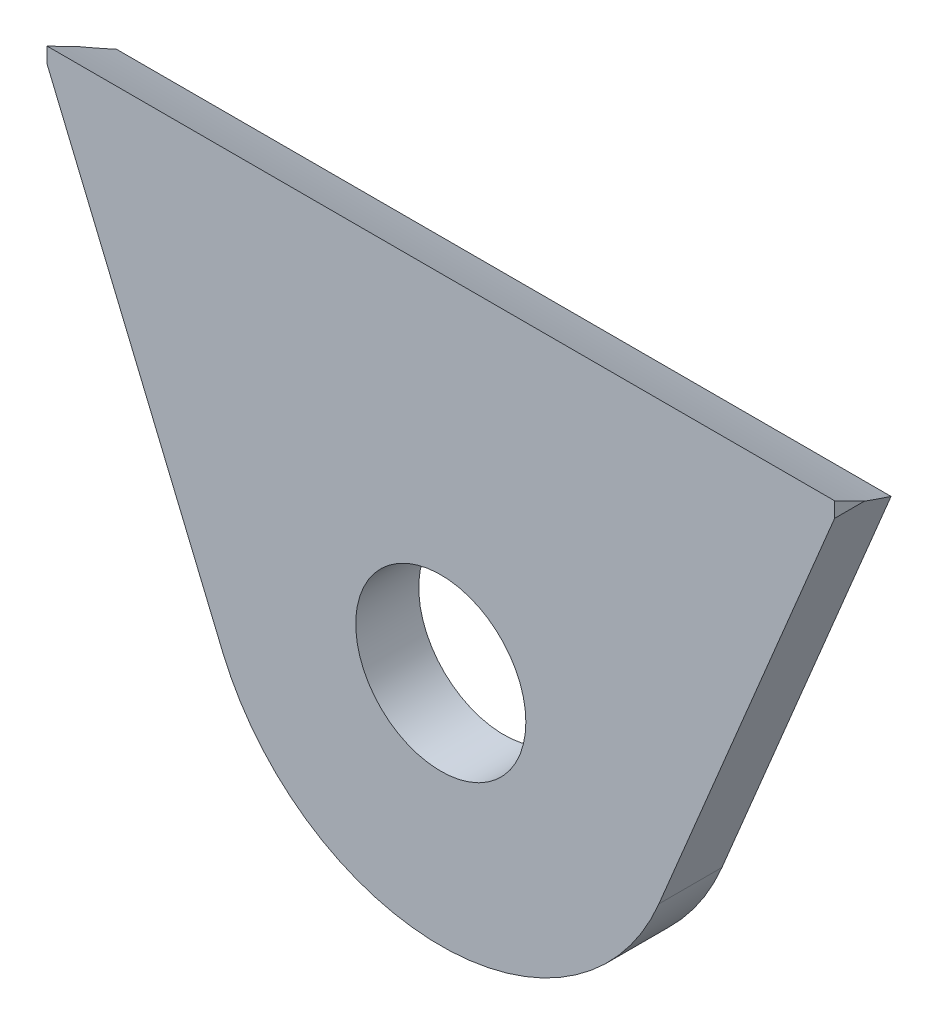
ISO-10303-21;
HEADER;
FILE_DESCRIPTION(('STEP AP214'),'2;1');
FILE_NAME('part.step','',(''),(''),'','','');
FILE_SCHEMA(('AUTOMOTIVE_DESIGN { 1 0 10303 214 1 1 1 1 }'));
ENDSEC;
DATA;
#1=APPLICATION_CONTEXT('core data for automotive mechanical design processes');
#2=APPLICATION_PROTOCOL_DEFINITION('international standard','automotive_design',2000,#1);
#3=PRODUCT_CONTEXT('',#1,'mechanical');
#4=PRODUCT('Part','Part','',(#3));
#5=PRODUCT_RELATED_PRODUCT_CATEGORY('part','',(#4));
#6=PRODUCT_DEFINITION_FORMATION('','',#4);
#7=PRODUCT_DEFINITION_CONTEXT('part definition',#1,'design');
#8=PRODUCT_DEFINITION('design','',#6,#7);
#9=PRODUCT_DEFINITION_SHAPE('','',#8);
#10=(LENGTH_UNIT() NAMED_UNIT(*) SI_UNIT(.MILLI.,.METRE.));
#11=(NAMED_UNIT(*) PLANE_ANGLE_UNIT() SI_UNIT($,.RADIAN.));
#12=(NAMED_UNIT(*) SI_UNIT($,.STERADIAN.) SOLID_ANGLE_UNIT());
#13=UNCERTAINTY_MEASURE_WITH_UNIT(LENGTH_MEASURE(1.E-05),#10,'distance_accuracy_value','');
#14=(GEOMETRIC_REPRESENTATION_CONTEXT(3) GLOBAL_UNCERTAINTY_ASSIGNED_CONTEXT((#13)) GLOBAL_UNIT_ASSIGNED_CONTEXT((#10,
#11,#12)) REPRESENTATION_CONTEXT('',''));
#15=CARTESIAN_POINT('',(0.,0.,0.));
#16=DIRECTION('',(0.,0.,1.));
#17=DIRECTION('',(1.,0.,0.));
#18=AXIS2_PLACEMENT_3D('',#15,#16,#17);
#19=CARTESIAN_POINT('',(25.,24.,4.));
#20=DIRECTION('',(-1.,0.,0.));
#21=DIRECTION('',(0.,0.,1.));
#22=AXIS2_PLACEMENT_3D('',#19,#20,#21);
#23=PLANE('',#22);
#24=CARTESIAN_POINT('',(25.,86.,-30.));
#25=DIRECTION('',(1.,0.,0.));
#26=DIRECTION('',(0.,0.,-1.));
#27=AXIS2_PLACEMENT_3D('',#24,#25,#26);
#28=CIRCLE('',#27,72.5);
#29=CARTESIAN_POINT('',(25.,21.9668054834057,4.));
#30=VERTEX_POINT('',#29);
#31=CARTESIAN_POINT('',(25.,21.,2.11308144666283));
#32=VERTEX_POINT('',#31);
#33=EDGE_CURVE('E57',#30,#32,#28,.T.);
#34=ORIENTED_EDGE('',*,*,#33,.F.);
#35=DIRECTION('',(0.,1.,0.));
#36=VECTOR('',#35,1.);
#37=CARTESIAN_POINT('',(25.,24.,4.));
#38=LINE('',#37,#36);
#39=CARTESIAN_POINT('',(25.,21.,4.));
#40=VERTEX_POINT('',#39);
#41=EDGE_CURVE('E113',#40,#30,#38,.T.);
#42=ORIENTED_EDGE('',*,*,#41,.F.);
#43=DIRECTION('',(0.,0.,-1.));
#44=VECTOR('',#43,1.);
#45=CARTESIAN_POINT('',(25.,21.,4.));
#46=LINE('',#45,#44);
#47=EDGE_CURVE('E119',#40,#32,#46,.T.);
#48=ORIENTED_EDGE('',*,*,#47,.T.);
#49=EDGE_LOOP('',(#34,#42,#48));
#50=FACE_BOUND('',#49,.T.);
#51=ADVANCED_FACE('F41',(#50),#23,.F.);
#52=CARTESIAN_POINT('',(0.,0.,4.));
#53=DIRECTION('',(0.,0.,1.));
#54=DIRECTION('',(1.,0.,0.));
#55=AXIS2_PLACEMENT_3D('',#52,#53,#54);
#56=PLANE('',#55);
#57=DIRECTION('',(1.,0.,0.));
#58=VECTOR('',#57,1.);
#59=CARTESIAN_POINT('',(-25.,21.9668054834057,4.));
#60=LINE('',#59,#58);
#61=CARTESIAN_POINT('',(-25.,21.9668054834057,4.));
#62=VERTEX_POINT('',#61);
#63=EDGE_CURVE('E105',#62,#30,#60,.T.);
#64=ORIENTED_EDGE('',*,*,#63,.F.);
#65=DIRECTION('',(0.,-1.,0.));
#66=VECTOR('',#65,1.);
#67=CARTESIAN_POINT('',(-25.,24.,4.));
#68=LINE('',#67,#66);
#69=CARTESIAN_POINT('',(-25.,21.,4.));
#70=VERTEX_POINT('',#69);
#71=EDGE_CURVE('E63',#62,#70,#68,.T.);
#72=ORIENTED_EDGE('',*,*,#71,.T.);
#73=DIRECTION('',(0.384615384615385,-0.923076923076923,0.));
#74=VECTOR('',#73,1.);
#75=CARTESIAN_POINT('',(-25.,21.,4.));
#76=LINE('',#75,#74);
#77=CARTESIAN_POINT('',(-13.8461538461538,-5.76923076923077,4.));
#78=VERTEX_POINT('',#77);
#79=EDGE_CURVE('E135',#70,#78,#76,.T.);
#80=ORIENTED_EDGE('',*,*,#79,.T.);
#81=CARTESIAN_POINT('',(0.,0.,4.));
#82=DIRECTION('',(0.,0.,1.));
#83=DIRECTION('',(1.,0.,0.));
#84=AXIS2_PLACEMENT_3D('',#81,#82,#83);
#85=CIRCLE('',#84,15.);
#86=CARTESIAN_POINT('',(13.8461538461538,-5.76923076923077,4.));
#87=VERTEX_POINT('',#86);
#88=EDGE_CURVE('E86',#78,#87,#85,.T.);
#89=ORIENTED_EDGE('',*,*,#88,.T.);
#90=DIRECTION('',(0.384615384615385,0.923076923076923,0.));
#91=VECTOR('',#90,1.);
#92=CARTESIAN_POINT('',(25.,21.,4.));
#93=LINE('',#92,#91);
#94=EDGE_CURVE('E125',#87,#40,#93,.T.);
#95=ORIENTED_EDGE('',*,*,#94,.T.);
#96=ORIENTED_EDGE('',*,*,#41,.T.);
#97=EDGE_LOOP('',(#64,#72,#80,#89,#95,#96));
#98=FACE_BOUND('',#97,.T.);
#99=CARTESIAN_POINT('',(0.,0.,4.));
#100=DIRECTION('',(0.,0.,1.));
#101=DIRECTION('',(1.,0.,0.));
#102=AXIS2_PLACEMENT_3D('',#99,#100,#101);
#103=CIRCLE('',#102,5.4);
#104=CARTESIAN_POINT('',(5.4,0.,4.));
#105=VERTEX_POINT('',#104);
#106=EDGE_CURVE('E130',#105,#105,#103,.T.);
#107=ORIENTED_EDGE('',*,*,#106,.F.);
#108=EDGE_LOOP('',(#107));
#109=FACE_BOUND('',#108,.T.);
#110=ADVANCED_FACE('F109',(#98,#109),#56,.T.);
#111=CARTESIAN_POINT('',(0.,0.,0.));
#112=DIRECTION('',(0.,0.,1.));
#113=DIRECTION('',(1.,0.,0.));
#114=AXIS2_PLACEMENT_3D('',#111,#112,#113);
#115=PLANE('',#114);
#116=DIRECTION('',(0.384615384615385,-0.923076923076923,0.));
#117=VECTOR('',#116,1.);
#118=CARTESIAN_POINT('',(-25.,21.,0.));
#119=LINE('',#118,#117);
#120=CARTESIAN_POINT('',(-24.5825442032415,19.9981060877796,0.));
#121=VERTEX_POINT('',#120);
#122=CARTESIAN_POINT('',(-13.8461538461538,-5.76923076923077,0.));
#123=VERTEX_POINT('',#122);
#124=EDGE_CURVE('E127',#121,#123,#119,.T.);
#125=ORIENTED_EDGE('',*,*,#124,.F.);
#126=DIRECTION('',(1.,0.,0.));
#127=VECTOR('',#126,1.);
#128=CARTESIAN_POINT('',(-25.,19.9981060877796,0.));
#129=LINE('',#128,#127);
#130=CARTESIAN_POINT('',(24.5825442032415,19.9981060877796,0.));
#131=VERTEX_POINT('',#130);
#132=EDGE_CURVE('E143',#121,#131,#129,.T.);
#133=ORIENTED_EDGE('',*,*,#132,.T.);
#134=DIRECTION('',(0.384615384615385,0.923076923076923,0.));
#135=VECTOR('',#134,1.);
#136=CARTESIAN_POINT('',(25.,21.,0.));
#137=LINE('',#136,#135);
#138=CARTESIAN_POINT('',(13.8461538461538,-5.76923076923077,0.));
#139=VERTEX_POINT('',#138);
#140=EDGE_CURVE('E128',#139,#131,#137,.T.);
#141=ORIENTED_EDGE('',*,*,#140,.F.);
#142=CARTESIAN_POINT('',(0.,0.,0.));
#143=DIRECTION('',(0.,0.,1.));
#144=DIRECTION('',(1.,0.,0.));
#145=AXIS2_PLACEMENT_3D('',#142,#143,#144);
#146=CIRCLE('',#145,15.);
#147=EDGE_CURVE('E82',#123,#139,#146,.T.);
#148=ORIENTED_EDGE('',*,*,#147,.F.);
#149=EDGE_LOOP('',(#125,#133,#141,#148));
#150=FACE_BOUND('',#149,.T.);
#151=CARTESIAN_POINT('',(0.,0.,0.));
#152=DIRECTION('',(0.,0.,1.));
#153=DIRECTION('',(1.,0.,0.));
#154=AXIS2_PLACEMENT_3D('',#151,#152,#153);
#155=CIRCLE('',#154,5.4);
#156=CARTESIAN_POINT('',(5.4,0.,0.));
#157=VERTEX_POINT('',#156);
#158=EDGE_CURVE('E112',#157,#157,#155,.T.);
#159=ORIENTED_EDGE('',*,*,#158,.T.);
#160=EDGE_LOOP('',(#159));
#161=FACE_BOUND('',#160,.T.);
#162=ADVANCED_FACE('F141',(#150,#161),#115,.F.);
#163=CARTESIAN_POINT('',(-25.,21.,4.));
#164=DIRECTION('',(0.923076923076923,0.384615384615385,0.));
#165=DIRECTION('',(-0.384615384615385,0.923076923076923,0.));
#166=AXIS2_PLACEMENT_3D('',#163,#164,#165);
#167=PLANE('',#166);
#168=DIRECTION('',(0.,0.,-1.));
#169=VECTOR('',#168,1.);
#170=CARTESIAN_POINT('',(-25.,21.,4.));
#171=LINE('',#170,#169);
#172=CARTESIAN_POINT('',(-25.,21.,2.11308144666283));
#173=VERTEX_POINT('',#172);
#174=EDGE_CURVE('E120',#70,#173,#171,.T.);
#175=ORIENTED_EDGE('',*,*,#174,.T.);
#176=CARTESIAN_POINT('',(-52.0833333333333,86.,-30.));
#177=DIRECTION('',(0.923076923076923,0.384615384615385,0.));
#178=DIRECTION('',(0.384615384615385,-0.923076923076923,0.));
#179=AXIS2_PLACEMENT_3D('',#176,#177,#178);
#180=ELLIPSE('',#179,78.5416666666667,72.5);
#181=EDGE_CURVE('E104',#173,#121,#180,.T.);
#182=ORIENTED_EDGE('',*,*,#181,.T.);
#183=ORIENTED_EDGE('',*,*,#124,.T.);
#184=DIRECTION('',(0.,0.,-1.));
#185=VECTOR('',#184,1.);
#186=CARTESIAN_POINT('',(-13.8461538461538,-5.76923076923077,4.));
#187=LINE('',#186,#185);
#188=EDGE_CURVE('E11',#78,#123,#187,.T.);
#189=ORIENTED_EDGE('',*,*,#188,.F.);
#190=ORIENTED_EDGE('',*,*,#79,.F.);
#191=EDGE_LOOP('',(#175,#182,#183,#189,#190));
#192=FACE_BOUND('',#191,.T.);
#193=ADVANCED_FACE('F43',(#192),#167,.F.);
#194=CARTESIAN_POINT('',(0.,0.,4.));
#195=DIRECTION('',(0.,0.,-1.));
#196=DIRECTION('',(-1.,0.,0.));
#197=AXIS2_PLACEMENT_3D('',#194,#195,#196);
#198=CYLINDRICAL_SURFACE('',#197,15.);
#199=ORIENTED_EDGE('',*,*,#147,.T.);
#200=DIRECTION('',(0.,0.,-1.));
#201=VECTOR('',#200,1.);
#202=CARTESIAN_POINT('',(13.8461538461538,-5.76923076923077,4.));
#203=LINE('',#202,#201);
#204=EDGE_CURVE('E47',#87,#139,#203,.T.);
#205=ORIENTED_EDGE('',*,*,#204,.F.);
#206=ORIENTED_EDGE('',*,*,#88,.F.);
#207=ORIENTED_EDGE('',*,*,#188,.T.);
#208=EDGE_LOOP('',(#199,#205,#206,#207));
#209=FACE_BOUND('',#208,.T.);
#210=ADVANCED_FACE('F166',(#209),#198,.T.);
#211=CARTESIAN_POINT('',(25.,21.,4.));
#212=DIRECTION('',(-0.923076923076923,0.384615384615385,0.));
#213=DIRECTION('',(-0.384615384615385,-0.923076923076923,0.));
#214=AXIS2_PLACEMENT_3D('',#211,#212,#213);
#215=PLANE('',#214);
#216=ORIENTED_EDGE('',*,*,#140,.T.);
#217=CARTESIAN_POINT('',(52.0833333333333,86.,-30.));
#218=DIRECTION('',(-0.923076923076923,0.384615384615385,0.));
#219=DIRECTION('',(0.384615384615385,0.923076923076923,0.));
#220=AXIS2_PLACEMENT_3D('',#217,#218,#219);
#221=ELLIPSE('',#220,78.5416666666666,72.5);
#222=EDGE_CURVE('E110',#131,#32,#221,.T.);
#223=ORIENTED_EDGE('',*,*,#222,.T.);
#224=ORIENTED_EDGE('',*,*,#47,.F.);
#225=ORIENTED_EDGE('',*,*,#94,.F.);
#226=ORIENTED_EDGE('',*,*,#204,.T.);
#227=EDGE_LOOP('',(#216,#223,#224,#225,#226));
#228=FACE_BOUND('',#227,.T.);
#229=ADVANCED_FACE('F139',(#228),#215,.F.);
#230=CARTESIAN_POINT('',(-25.,24.,4.));
#231=DIRECTION('',(1.,0.,0.));
#232=DIRECTION('',(0.,0.,-1.));
#233=AXIS2_PLACEMENT_3D('',#230,#231,#232);
#234=PLANE('',#233);
#235=ORIENTED_EDGE('',*,*,#71,.F.);
#236=CARTESIAN_POINT('',(-25.,86.,-30.));
#237=DIRECTION('',(1.,0.,0.));
#238=DIRECTION('',(0.,0.,-1.));
#239=AXIS2_PLACEMENT_3D('',#236,#237,#238);
#240=CIRCLE('',#239,72.5);
#241=EDGE_CURVE('E99',#62,#173,#240,.T.);
#242=ORIENTED_EDGE('',*,*,#241,.T.);
#243=ORIENTED_EDGE('',*,*,#174,.F.);
#244=EDGE_LOOP('',(#235,#242,#243));
#245=FACE_BOUND('',#244,.T.);
#246=ADVANCED_FACE('F116',(#245),#234,.F.);
#247=CARTESIAN_POINT('',(0.,0.,4.));
#248=DIRECTION('',(0.,0.,-1.));
#249=DIRECTION('',(-1.,0.,0.));
#250=AXIS2_PLACEMENT_3D('',#247,#248,#249);
#251=CYLINDRICAL_SURFACE('',#250,5.4);
#252=ORIENTED_EDGE('',*,*,#106,.T.);
#253=EDGE_LOOP('',(#252));
#254=FACE_BOUND('',#253,.T.);
#255=ORIENTED_EDGE('',*,*,#158,.F.);
#256=EDGE_LOOP('',(#255));
#257=FACE_BOUND('',#256,.T.);
#258=ADVANCED_FACE('F181',(#254,#257),#251,.F.);
#259=CARTESIAN_POINT('',(-25.,86.,-30.));
#260=DIRECTION('',(1.,0.,0.));
#261=DIRECTION('',(0.,0.,-1.));
#262=AXIS2_PLACEMENT_3D('',#259,#260,#261);
#263=CYLINDRICAL_SURFACE('',#262,72.5);
#264=ORIENTED_EDGE('',*,*,#63,.T.);
#265=ORIENTED_EDGE('',*,*,#33,.T.);
#266=ORIENTED_EDGE('',*,*,#222,.F.);
#267=ORIENTED_EDGE('',*,*,#132,.F.);
#268=ORIENTED_EDGE('',*,*,#181,.F.);
#269=ORIENTED_EDGE('',*,*,#241,.F.);
#270=EDGE_LOOP('',(#264,#265,#266,#267,#268,#269));
#271=FACE_BOUND('',#270,.T.);
#272=ADVANCED_FACE('F103',(#271),#263,.F.);
#273=CLOSED_SHELL('',(#51,#110,#162,#193,#210,#229,#246,#258,#272));
#274=MANIFOLD_SOLID_BREP('B2',#273);
#275=ADVANCED_BREP_SHAPE_REPRESENTATION('',(#18,#274),#14);
#276=SHAPE_DEFINITION_REPRESENTATION(#9,#275);
ENDSEC;
END-ISO-10303-21;
